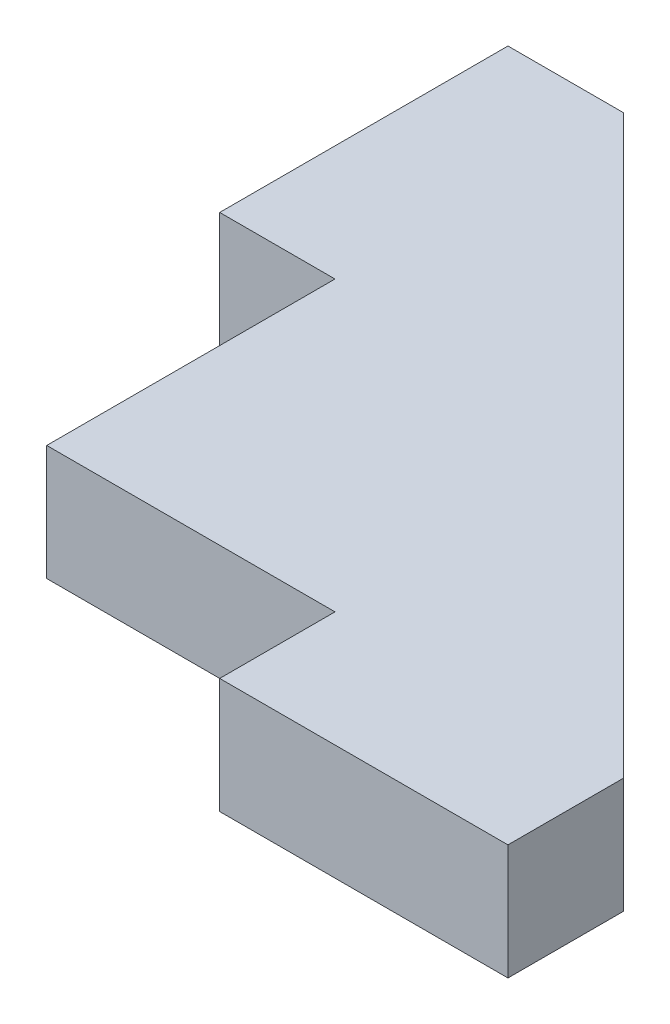
ISO-10303-21;
HEADER;
FILE_DESCRIPTION(('STEP AP214'),'2;1');
FILE_NAME('part.step','',(''),(''),'','','');
FILE_SCHEMA(('AUTOMOTIVE_DESIGN { 1 0 10303 214 1 1 1 1 }'));
ENDSEC;
DATA;
#1=APPLICATION_CONTEXT('core data for automotive mechanical design processes');
#2=APPLICATION_PROTOCOL_DEFINITION('international standard','automotive_design',2000,#1);
#3=PRODUCT_CONTEXT('',#1,'mechanical');
#4=PRODUCT('Part','Part','',(#3));
#5=PRODUCT_RELATED_PRODUCT_CATEGORY('part','',(#4));
#6=PRODUCT_DEFINITION_FORMATION('','',#4);
#7=PRODUCT_DEFINITION_CONTEXT('part definition',#1,'design');
#8=PRODUCT_DEFINITION('design','',#6,#7);
#9=PRODUCT_DEFINITION_SHAPE('','',#8);
#10=(LENGTH_UNIT() NAMED_UNIT(*) SI_UNIT(.MILLI.,.METRE.));
#11=(NAMED_UNIT(*) PLANE_ANGLE_UNIT() SI_UNIT($,.RADIAN.));
#12=(NAMED_UNIT(*) SI_UNIT($,.STERADIAN.) SOLID_ANGLE_UNIT());
#13=UNCERTAINTY_MEASURE_WITH_UNIT(LENGTH_MEASURE(1.E-05),#10,'distance_accuracy_value','');
#14=(GEOMETRIC_REPRESENTATION_CONTEXT(3) GLOBAL_UNCERTAINTY_ASSIGNED_CONTEXT((#13)) GLOBAL_UNIT_ASSIGNED_CONTEXT((#10,
#11,#12)) REPRESENTATION_CONTEXT('',''));
#15=CARTESIAN_POINT('',(0.,0.,0.));
#16=DIRECTION('',(0.,0.,1.));
#17=DIRECTION('',(1.,0.,0.));
#18=AXIS2_PLACEMENT_3D('',#15,#16,#17);
#19=CARTESIAN_POINT('',(5.,2.,-5.));
#20=DIRECTION('',(-0.707106781186547,0.,0.707106781186547));
#21=DIRECTION('',(0.707106781186548,0.,0.707106781186548));
#22=AXIS2_PLACEMENT_3D('',#19,#20,#21);
#23=PLANE('',#22);
#24=DIRECTION('',(-0.707106781186548,0.,-0.707106781186548));
#25=VECTOR('',#24,1.);
#26=CARTESIAN_POINT('',(5.,0.,-5.));
#27=LINE('',#26,#25);
#28=CARTESIAN_POINT('',(10.,0.,0.));
#29=VERTEX_POINT('',#28);
#30=CARTESIAN_POINT('',(0.,0.,-10.));
#31=VERTEX_POINT('',#30);
#32=EDGE_CURVE('E137',#29,#31,#27,.T.);
#33=ORIENTED_EDGE('',*,*,#32,.T.);
#34=DIRECTION('',(0.,-1.,0.));
#35=VECTOR('',#34,1.);
#36=CARTESIAN_POINT('',(0.,2.,-10.));
#37=LINE('',#36,#35);
#38=CARTESIAN_POINT('',(0.,2.,-10.));
#39=VERTEX_POINT('',#38);
#40=EDGE_CURVE('E11',#39,#31,#37,.T.);
#41=ORIENTED_EDGE('',*,*,#40,.F.);
#42=DIRECTION('',(-0.707106781186548,0.,-0.707106781186548));
#43=VECTOR('',#42,1.);
#44=CARTESIAN_POINT('',(5.,2.,-5.));
#45=LINE('',#44,#43);
#46=CARTESIAN_POINT('',(10.,2.,0.));
#47=VERTEX_POINT('',#46);
#48=EDGE_CURVE('E157',#47,#39,#45,.T.);
#49=ORIENTED_EDGE('',*,*,#48,.F.);
#50=DIRECTION('',(0.,-1.,0.));
#51=VECTOR('',#50,1.);
#52=CARTESIAN_POINT('',(10.,2.,0.));
#53=LINE('',#52,#51);
#54=EDGE_CURVE('E50',#47,#29,#53,.T.);
#55=ORIENTED_EDGE('',*,*,#54,.T.);
#56=EDGE_LOOP('',(#33,#41,#49,#55));
#57=FACE_BOUND('',#56,.T.);
#58=ADVANCED_FACE('F34',(#57),#23,.F.);
#59=CARTESIAN_POINT('',(0.,2.,-10.));
#60=DIRECTION('',(0.,0.,1.));
#61=DIRECTION('',(1.,0.,0.));
#62=AXIS2_PLACEMENT_3D('',#59,#60,#61);
#63=PLANE('',#62);
#64=DIRECTION('',(-1.,0.,0.));
#65=VECTOR('',#64,1.);
#66=CARTESIAN_POINT('',(0.,0.,-10.));
#67=LINE('',#66,#65);
#68=CARTESIAN_POINT('',(-2.,0.,-10.));
#69=VERTEX_POINT('',#68);
#70=EDGE_CURVE('E139',#31,#69,#67,.T.);
#71=ORIENTED_EDGE('',*,*,#70,.T.);
#72=DIRECTION('',(0.,-1.,0.));
#73=VECTOR('',#72,1.);
#74=CARTESIAN_POINT('',(-2.,2.,-10.));
#75=LINE('',#74,#73);
#76=CARTESIAN_POINT('',(-2.,2.,-10.));
#77=VERTEX_POINT('',#76);
#78=EDGE_CURVE('E42',#77,#69,#75,.T.);
#79=ORIENTED_EDGE('',*,*,#78,.F.);
#80=DIRECTION('',(-1.,0.,0.));
#81=VECTOR('',#80,1.);
#82=CARTESIAN_POINT('',(0.,2.,-10.));
#83=LINE('',#82,#81);
#84=EDGE_CURVE('E91',#39,#77,#83,.T.);
#85=ORIENTED_EDGE('',*,*,#84,.F.);
#86=ORIENTED_EDGE('',*,*,#40,.T.);
#87=EDGE_LOOP('',(#71,#79,#85,#86));
#88=FACE_BOUND('',#87,.T.);
#89=ADVANCED_FACE('F192',(#88),#63,.F.);
#90=CARTESIAN_POINT('',(-2.,2.,0.));
#91=DIRECTION('',(1.,0.,0.));
#92=DIRECTION('',(0.,0.,-1.));
#93=AXIS2_PLACEMENT_3D('',#90,#91,#92);
#94=PLANE('',#93);
#95=DIRECTION('',(0.,0.,1.));
#96=VECTOR('',#95,1.);
#97=CARTESIAN_POINT('',(-2.,0.,0.));
#98=LINE('',#97,#96);
#99=CARTESIAN_POINT('',(-2.,0.,-5.));
#100=VERTEX_POINT('',#99);
#101=EDGE_CURVE('E141',#69,#100,#98,.T.);
#102=ORIENTED_EDGE('',*,*,#101,.T.);
#103=DIRECTION('',(0.,-1.,0.));
#104=VECTOR('',#103,1.);
#105=CARTESIAN_POINT('',(-2.,2.,-5.));
#106=LINE('',#105,#104);
#107=CARTESIAN_POINT('',(-2.,2.,-5.));
#108=VERTEX_POINT('',#107);
#109=EDGE_CURVE('E166',#108,#100,#106,.T.);
#110=ORIENTED_EDGE('',*,*,#109,.F.);
#111=DIRECTION('',(0.,0.,1.));
#112=VECTOR('',#111,1.);
#113=CARTESIAN_POINT('',(-2.,2.,0.));
#114=LINE('',#113,#112);
#115=EDGE_CURVE('E173',#77,#108,#114,.T.);
#116=ORIENTED_EDGE('',*,*,#115,.F.);
#117=ORIENTED_EDGE('',*,*,#78,.T.);
#118=EDGE_LOOP('',(#102,#110,#116,#117));
#119=FACE_BOUND('',#118,.T.);
#120=ADVANCED_FACE('F171',(#119),#94,.F.);
#121=CARTESIAN_POINT('',(0.,2.,-5.));
#122=DIRECTION('',(0.,0.,1.));
#123=DIRECTION('',(1.,0.,0.));
#124=AXIS2_PLACEMENT_3D('',#121,#122,#123);
#125=PLANE('',#124);
#126=DIRECTION('',(-1.,0.,0.));
#127=VECTOR('',#126,1.);
#128=CARTESIAN_POINT('',(0.,0.,-5.));
#129=LINE('',#128,#127);
#130=CARTESIAN_POINT('',(0.,0.,-5.));
#131=VERTEX_POINT('',#130);
#132=EDGE_CURVE('E144',#131,#100,#129,.T.);
#133=ORIENTED_EDGE('',*,*,#132,.F.);
#134=DIRECTION('',(0.,-1.,0.));
#135=VECTOR('',#134,1.);
#136=CARTESIAN_POINT('',(0.,2.,-5.));
#137=LINE('',#136,#135);
#138=CARTESIAN_POINT('',(0.,2.,-5.));
#139=VERTEX_POINT('',#138);
#140=EDGE_CURVE('E164',#139,#131,#137,.T.);
#141=ORIENTED_EDGE('',*,*,#140,.F.);
#142=DIRECTION('',(-1.,0.,0.));
#143=VECTOR('',#142,1.);
#144=CARTESIAN_POINT('',(0.,2.,-5.));
#145=LINE('',#144,#143);
#146=EDGE_CURVE('E184',#139,#108,#145,.T.);
#147=ORIENTED_EDGE('',*,*,#146,.T.);
#148=ORIENTED_EDGE('',*,*,#109,.T.);
#149=EDGE_LOOP('',(#133,#141,#147,#148));
#150=FACE_BOUND('',#149,.T.);
#151=ADVANCED_FACE('F180',(#150),#125,.T.);
#152=CARTESIAN_POINT('',(0.,2.,0.));
#153=DIRECTION('',(1.,0.,0.));
#154=DIRECTION('',(0.,0.,-1.));
#155=AXIS2_PLACEMENT_3D('',#152,#153,#154);
#156=PLANE('',#155);
#157=DIRECTION('',(0.,0.,1.));
#158=VECTOR('',#157,1.);
#159=CARTESIAN_POINT('',(0.,0.,0.));
#160=LINE('',#159,#158);
#161=CARTESIAN_POINT('',(0.,0.,0.));
#162=VERTEX_POINT('',#161);
#163=EDGE_CURVE('E147',#131,#162,#160,.T.);
#164=ORIENTED_EDGE('',*,*,#163,.T.);
#165=DIRECTION('',(0.,-1.,0.));
#166=VECTOR('',#165,1.);
#167=CARTESIAN_POINT('',(0.,2.,0.));
#168=LINE('',#167,#166);
#169=CARTESIAN_POINT('',(0.,2.,0.));
#170=VERTEX_POINT('',#169);
#171=EDGE_CURVE('E161',#170,#162,#168,.T.);
#172=ORIENTED_EDGE('',*,*,#171,.F.);
#173=DIRECTION('',(0.,0.,1.));
#174=VECTOR('',#173,1.);
#175=CARTESIAN_POINT('',(0.,2.,0.));
#176=LINE('',#175,#174);
#177=EDGE_CURVE('E185',#139,#170,#176,.T.);
#178=ORIENTED_EDGE('',*,*,#177,.F.);
#179=ORIENTED_EDGE('',*,*,#140,.T.);
#180=EDGE_LOOP('',(#164,#172,#178,#179));
#181=FACE_BOUND('',#180,.T.);
#182=ADVANCED_FACE('F202',(#181),#156,.F.);
#183=CARTESIAN_POINT('',(0.,2.,0.));
#184=DIRECTION('',(0.,0.,-1.));
#185=DIRECTION('',(-1.,0.,0.));
#186=AXIS2_PLACEMENT_3D('',#183,#184,#185);
#187=PLANE('',#186);
#188=DIRECTION('',(1.,0.,0.));
#189=VECTOR('',#188,1.);
#190=CARTESIAN_POINT('',(0.,0.,0.));
#191=LINE('',#190,#189);
#192=CARTESIAN_POINT('',(5.,0.,0.));
#193=VERTEX_POINT('',#192);
#194=EDGE_CURVE('E149',#162,#193,#191,.T.);
#195=ORIENTED_EDGE('',*,*,#194,.T.);
#196=DIRECTION('',(0.,-1.,0.));
#197=VECTOR('',#196,1.);
#198=CARTESIAN_POINT('',(5.,2.,0.));
#199=LINE('',#198,#197);
#200=CARTESIAN_POINT('',(5.,2.,0.));
#201=VERTEX_POINT('',#200);
#202=EDGE_CURVE('E129',#201,#193,#199,.T.);
#203=ORIENTED_EDGE('',*,*,#202,.F.);
#204=DIRECTION('',(1.,0.,0.));
#205=VECTOR('',#204,1.);
#206=CARTESIAN_POINT('',(0.,2.,0.));
#207=LINE('',#206,#205);
#208=EDGE_CURVE('E117',#170,#201,#207,.T.);
#209=ORIENTED_EDGE('',*,*,#208,.F.);
#210=ORIENTED_EDGE('',*,*,#171,.T.);
#211=EDGE_LOOP('',(#195,#203,#209,#210));
#212=FACE_BOUND('',#211,.T.);
#213=ADVANCED_FACE('F205',(#212),#187,.F.);
#214=CARTESIAN_POINT('',(5.,2.,0.));
#215=DIRECTION('',(1.,0.,0.));
#216=DIRECTION('',(0.,0.,-1.));
#217=AXIS2_PLACEMENT_3D('',#214,#215,#216);
#218=PLANE('',#217);
#219=DIRECTION('',(0.,0.,1.));
#220=VECTOR('',#219,1.);
#221=CARTESIAN_POINT('',(5.,0.,0.));
#222=LINE('',#221,#220);
#223=CARTESIAN_POINT('',(5.,0.,2.));
#224=VERTEX_POINT('',#223);
#225=EDGE_CURVE('E126',#193,#224,#222,.T.);
#226=ORIENTED_EDGE('',*,*,#225,.T.);
#227=DIRECTION('',(0.,-1.,0.));
#228=VECTOR('',#227,1.);
#229=CARTESIAN_POINT('',(5.,2.,2.));
#230=LINE('',#229,#228);
#231=CARTESIAN_POINT('',(5.,2.,2.));
#232=VERTEX_POINT('',#231);
#233=EDGE_CURVE('E123',#232,#224,#230,.T.);
#234=ORIENTED_EDGE('',*,*,#233,.F.);
#235=DIRECTION('',(0.,0.,1.));
#236=VECTOR('',#235,1.);
#237=CARTESIAN_POINT('',(5.,2.,0.));
#238=LINE('',#237,#236);
#239=EDGE_CURVE('E110',#201,#232,#238,.T.);
#240=ORIENTED_EDGE('',*,*,#239,.F.);
#241=ORIENTED_EDGE('',*,*,#202,.T.);
#242=EDGE_LOOP('',(#226,#234,#240,#241));
#243=FACE_BOUND('',#242,.T.);
#244=ADVANCED_FACE('F124',(#243),#218,.F.);
#245=CARTESIAN_POINT('',(0.,2.,2.));
#246=DIRECTION('',(0.,0.,1.));
#247=DIRECTION('',(1.,0.,0.));
#248=AXIS2_PLACEMENT_3D('',#245,#246,#247);
#249=PLANE('',#248);
#250=DIRECTION('',(-1.,0.,0.));
#251=VECTOR('',#250,1.);
#252=CARTESIAN_POINT('',(0.,0.,2.));
#253=LINE('',#252,#251);
#254=CARTESIAN_POINT('',(10.,0.,2.));
#255=VERTEX_POINT('',#254);
#256=EDGE_CURVE('E152',#255,#224,#253,.T.);
#257=ORIENTED_EDGE('',*,*,#256,.F.);
#258=DIRECTION('',(0.,-1.,0.));
#259=VECTOR('',#258,1.);
#260=CARTESIAN_POINT('',(10.,2.,2.));
#261=LINE('',#260,#259);
#262=CARTESIAN_POINT('',(10.,2.,2.));
#263=VERTEX_POINT('',#262);
#264=EDGE_CURVE('E79',#263,#255,#261,.T.);
#265=ORIENTED_EDGE('',*,*,#264,.F.);
#266=DIRECTION('',(-1.,0.,0.));
#267=VECTOR('',#266,1.);
#268=CARTESIAN_POINT('',(0.,2.,2.));
#269=LINE('',#268,#267);
#270=EDGE_CURVE('E115',#263,#232,#269,.T.);
#271=ORIENTED_EDGE('',*,*,#270,.T.);
#272=ORIENTED_EDGE('',*,*,#233,.T.);
#273=EDGE_LOOP('',(#257,#265,#271,#272));
#274=FACE_BOUND('',#273,.T.);
#275=ADVANCED_FACE('F131',(#274),#249,.T.);
#276=CARTESIAN_POINT('',(10.,2.,0.));
#277=DIRECTION('',(1.,0.,0.));
#278=DIRECTION('',(0.,0.,-1.));
#279=AXIS2_PLACEMENT_3D('',#276,#277,#278);
#280=PLANE('',#279);
#281=DIRECTION('',(0.,0.,1.));
#282=VECTOR('',#281,1.);
#283=CARTESIAN_POINT('',(10.,0.,0.));
#284=LINE('',#283,#282);
#285=EDGE_CURVE('E154',#29,#255,#284,.T.);
#286=ORIENTED_EDGE('',*,*,#285,.F.);
#287=ORIENTED_EDGE('',*,*,#54,.F.);
#288=DIRECTION('',(0.,0.,1.));
#289=VECTOR('',#288,1.);
#290=CARTESIAN_POINT('',(10.,2.,0.));
#291=LINE('',#290,#289);
#292=EDGE_CURVE('E132',#47,#263,#291,.T.);
#293=ORIENTED_EDGE('',*,*,#292,.T.);
#294=ORIENTED_EDGE('',*,*,#264,.T.);
#295=EDGE_LOOP('',(#286,#287,#293,#294));
#296=FACE_BOUND('',#295,.T.);
#297=ADVANCED_FACE('F214',(#296),#280,.T.);
#298=CARTESIAN_POINT('',(0.,2.,0.));
#299=DIRECTION('',(0.,1.,0.));
#300=DIRECTION('',(0.,0.,1.));
#301=AXIS2_PLACEMENT_3D('',#298,#299,#300);
#302=PLANE('',#301);
#303=ORIENTED_EDGE('',*,*,#48,.T.);
#304=ORIENTED_EDGE('',*,*,#84,.T.);
#305=ORIENTED_EDGE('',*,*,#115,.T.);
#306=ORIENTED_EDGE('',*,*,#146,.F.);
#307=ORIENTED_EDGE('',*,*,#177,.T.);
#308=ORIENTED_EDGE('',*,*,#208,.T.);
#309=ORIENTED_EDGE('',*,*,#239,.T.);
#310=ORIENTED_EDGE('',*,*,#270,.F.);
#311=ORIENTED_EDGE('',*,*,#292,.F.);
#312=EDGE_LOOP('',(#303,#304,#305,#306,#307,#308,#309,#310,#311));
#313=FACE_BOUND('',#312,.T.);
#314=ADVANCED_FACE('F112',(#313),#302,.T.);
#315=CARTESIAN_POINT('',(0.,0.,0.));
#316=DIRECTION('',(0.,1.,0.));
#317=DIRECTION('',(0.,0.,1.));
#318=AXIS2_PLACEMENT_3D('',#315,#316,#317);
#319=PLANE('',#318);
#320=ORIENTED_EDGE('',*,*,#32,.F.);
#321=ORIENTED_EDGE('',*,*,#285,.T.);
#322=ORIENTED_EDGE('',*,*,#256,.T.);
#323=ORIENTED_EDGE('',*,*,#225,.F.);
#324=ORIENTED_EDGE('',*,*,#194,.F.);
#325=ORIENTED_EDGE('',*,*,#163,.F.);
#326=ORIENTED_EDGE('',*,*,#132,.T.);
#327=ORIENTED_EDGE('',*,*,#101,.F.);
#328=ORIENTED_EDGE('',*,*,#70,.F.);
#329=EDGE_LOOP('',(#320,#321,#322,#323,#324,#325,#326,#327,#328));
#330=FACE_BOUND('',#329,.T.);
#331=ADVANCED_FACE('F175',(#330),#319,.F.);
#332=CLOSED_SHELL('',(#58,#89,#120,#151,#182,#213,#244,#275,#297,#314,#331));
#333=MANIFOLD_SOLID_BREP('B2',#332);
#334=ADVANCED_BREP_SHAPE_REPRESENTATION('',(#18,#333),#14);
#335=SHAPE_DEFINITION_REPRESENTATION(#9,#334);
ENDSEC;
END-ISO-10303-21;
